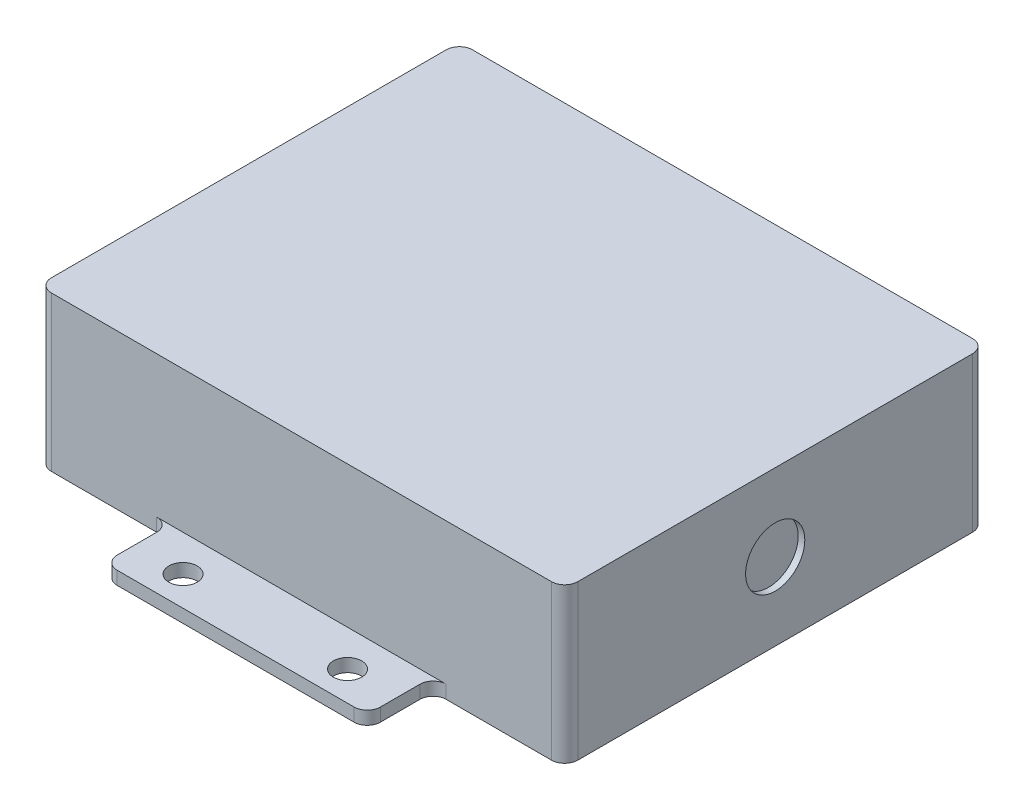
ISO-10303-21;
HEADER;
FILE_DESCRIPTION(('STEP AP214'),'2;1');
FILE_NAME('part.step','',(''),(''),'','','');
FILE_SCHEMA(('AUTOMOTIVE_DESIGN { 1 0 10303 214 1 1 1 1 }'));
ENDSEC;
DATA;
#1=APPLICATION_CONTEXT('core data for automotive mechanical design processes');
#2=APPLICATION_PROTOCOL_DEFINITION('international standard','automotive_design',2000,#1);
#3=PRODUCT_CONTEXT('',#1,'mechanical');
#4=PRODUCT('Part','Part','',(#3));
#5=PRODUCT_RELATED_PRODUCT_CATEGORY('part','',(#4));
#6=PRODUCT_DEFINITION_FORMATION('','',#4);
#7=PRODUCT_DEFINITION_CONTEXT('part definition',#1,'design');
#8=PRODUCT_DEFINITION('design','',#6,#7);
#9=PRODUCT_DEFINITION_SHAPE('','',#8);
#10=(LENGTH_UNIT() NAMED_UNIT(*) SI_UNIT(.MILLI.,.METRE.));
#11=(NAMED_UNIT(*) PLANE_ANGLE_UNIT() SI_UNIT($,.RADIAN.));
#12=(NAMED_UNIT(*) SI_UNIT($,.STERADIAN.) SOLID_ANGLE_UNIT());
#13=UNCERTAINTY_MEASURE_WITH_UNIT(LENGTH_MEASURE(1.E-05),#10,'distance_accuracy_value','');
#14=(GEOMETRIC_REPRESENTATION_CONTEXT(3) GLOBAL_UNCERTAINTY_ASSIGNED_CONTEXT((#13)) GLOBAL_UNIT_ASSIGNED_CONTEXT((#10,
#11,#12)) REPRESENTATION_CONTEXT('',''));
#15=CARTESIAN_POINT('',(0.,0.,0.));
#16=DIRECTION('',(0.,0.,1.));
#17=DIRECTION('',(1.,0.,0.));
#18=AXIS2_PLACEMENT_3D('',#15,#16,#17);
#19=CARTESIAN_POINT('',(0.,23.5,0.));
#20=DIRECTION('',(0.,-1.,0.));
#21=DIRECTION('',(0.,0.,-1.));
#22=AXIS2_PLACEMENT_3D('',#19,#20,#21);
#23=PLANE('',#22);
#24=DIRECTION('',(1.,0.,0.));
#25=VECTOR('',#24,1.);
#26=CARTESIAN_POINT('',(-40.,23.5,-32.));
#27=LINE('',#26,#25);
#28=CARTESIAN_POINT('',(-38.,23.5,-32.));
#29=VERTEX_POINT('',#28);
#30=CARTESIAN_POINT('',(38.,23.5,-32.));
#31=VERTEX_POINT('',#30);
#32=EDGE_CURVE('E474',#29,#31,#27,.T.);
#33=ORIENTED_EDGE('',*,*,#32,.F.);
#34=CARTESIAN_POINT('',(-38.,23.5,-30.));
#35=DIRECTION('',(0.,-1.,0.));
#36=DIRECTION('',(0.,0.,-1.));
#37=AXIS2_PLACEMENT_3D('',#34,#35,#36);
#38=CIRCLE('',#37,2.);
#39=CARTESIAN_POINT('',(-40.,23.5,-30.));
#40=VERTEX_POINT('',#39);
#41=EDGE_CURVE('E367',#29,#40,#38,.F.);
#42=ORIENTED_EDGE('',*,*,#41,.T.);
#43=DIRECTION('',(0.,0.,1.));
#44=VECTOR('',#43,1.);
#45=CARTESIAN_POINT('',(-40.,23.5,42.));
#46=LINE('',#45,#44);
#47=CARTESIAN_POINT('',(-40.,23.5,30.));
#48=VERTEX_POINT('',#47);
#49=EDGE_CURVE('E293',#40,#48,#46,.T.);
#50=ORIENTED_EDGE('',*,*,#49,.T.);
#51=CARTESIAN_POINT('',(-38.,23.5,30.));
#52=DIRECTION('',(0.,-1.,0.));
#53=DIRECTION('',(0.,0.,-1.));
#54=AXIS2_PLACEMENT_3D('',#51,#52,#53);
#55=CIRCLE('',#54,2.);
#56=CARTESIAN_POINT('',(-38.,23.5,32.));
#57=VERTEX_POINT('',#56);
#58=EDGE_CURVE('E365',#48,#57,#55,.F.);
#59=ORIENTED_EDGE('',*,*,#58,.T.);
#60=DIRECTION('',(-1.,0.,0.));
#61=VECTOR('',#60,1.);
#62=CARTESIAN_POINT('',(40.,23.5,32.));
#63=LINE('',#62,#61);
#64=CARTESIAN_POINT('',(38.,23.5,32.));
#65=VERTEX_POINT('',#64);
#66=EDGE_CURVE('E478',#65,#57,#63,.T.);
#67=ORIENTED_EDGE('',*,*,#66,.F.);
#68=CARTESIAN_POINT('',(38.,23.5,30.));
#69=DIRECTION('',(0.,-1.,0.));
#70=DIRECTION('',(0.,0.,-1.));
#71=AXIS2_PLACEMENT_3D('',#68,#69,#70);
#72=CIRCLE('',#71,2.);
#73=CARTESIAN_POINT('',(40.,23.5,30.));
#74=VERTEX_POINT('',#73);
#75=EDGE_CURVE('E361',#65,#74,#72,.F.);
#76=ORIENTED_EDGE('',*,*,#75,.T.);
#77=DIRECTION('',(0.,0.,-1.));
#78=VECTOR('',#77,1.);
#79=CARTESIAN_POINT('',(40.,23.5,42.));
#80=LINE('',#79,#78);
#81=CARTESIAN_POINT('',(40.,23.5,-30.));
#82=VERTEX_POINT('',#81);
#83=EDGE_CURVE('E290',#74,#82,#80,.T.);
#84=ORIENTED_EDGE('',*,*,#83,.T.);
#85=CARTESIAN_POINT('',(38.,23.5,-30.));
#86=DIRECTION('',(0.,-1.,0.));
#87=DIRECTION('',(0.,0.,-1.));
#88=AXIS2_PLACEMENT_3D('',#85,#86,#87);
#89=CIRCLE('',#88,2.);
#90=EDGE_CURVE('E363',#82,#31,#89,.F.);
#91=ORIENTED_EDGE('',*,*,#90,.T.);
#92=EDGE_LOOP('',(#33,#42,#50,#59,#67,#76,#84,#91));
#93=FACE_BOUND('',#92,.T.);
#94=ADVANCED_FACE('F45',(#93),#23,.F.);
#95=CARTESIAN_POINT('',(40.,23.5,42.));
#96=DIRECTION('',(-1.,0.,0.));
#97=DIRECTION('',(0.,0.,1.));
#98=AXIS2_PLACEMENT_3D('',#95,#96,#97);
#99=PLANE('',#98);
#100=CARTESIAN_POINT('',(40.,11.75,0.));
#101=DIRECTION('',(1.,0.,0.));
#102=DIRECTION('',(0.,0.,-1.));
#103=AXIS2_PLACEMENT_3D('',#100,#101,#102);
#104=CIRCLE('',#103,4.5);
#105=CARTESIAN_POINT('',(40.,11.75,-4.5));
#106=VERTEX_POINT('',#105);
#107=EDGE_CURVE('E261',#106,#106,#104,.T.);
#108=ORIENTED_EDGE('',*,*,#107,.F.);
#109=EDGE_LOOP('',(#108));
#110=FACE_BOUND('',#109,.T.);
#111=DIRECTION('',(0.,0.,-1.));
#112=VECTOR('',#111,1.);
#113=CARTESIAN_POINT('',(40.,0.,42.));
#114=LINE('',#113,#112);
#115=CARTESIAN_POINT('',(40.,0.,30.));
#116=VERTEX_POINT('',#115);
#117=CARTESIAN_POINT('',(40.,0.,-30.));
#118=VERTEX_POINT('',#117);
#119=EDGE_CURVE('E289',#116,#118,#114,.T.);
#120=ORIENTED_EDGE('',*,*,#119,.T.);
#121=DIRECTION('',(0.,1.,0.));
#122=VECTOR('',#121,1.);
#123=CARTESIAN_POINT('',(40.,23.5,-30.));
#124=LINE('',#123,#122);
#125=EDGE_CURVE('E403',#118,#82,#124,.T.);
#126=ORIENTED_EDGE('',*,*,#125,.T.);
#127=ORIENTED_EDGE('',*,*,#83,.F.);
#128=DIRECTION('',(0.,1.,0.));
#129=VECTOR('',#128,1.);
#130=CARTESIAN_POINT('',(40.,23.5,30.));
#131=LINE('',#130,#129);
#132=EDGE_CURVE('E401',#74,#116,#131,.F.);
#133=ORIENTED_EDGE('',*,*,#132,.T.);
#134=EDGE_LOOP('',(#120,#126,#127,#133));
#135=FACE_BOUND('',#134,.T.);
#136=ADVANCED_FACE('F496',(#110,#135),#99,.F.);
#137=CARTESIAN_POINT('',(-40.,23.5,-42.));
#138=DIRECTION('',(0.,0.,1.));
#139=DIRECTION('',(1.,0.,0.));
#140=AXIS2_PLACEMENT_3D('',#137,#138,#139);
#141=PLANE('',#140);
#142=DIRECTION('',(-1.,0.,0.));
#143=VECTOR('',#142,1.);
#144=CARTESIAN_POINT('',(-40.,2.,-42.));
#145=LINE('',#144,#143);
#146=CARTESIAN_POINT('',(18.,2.,-42.));
#147=VERTEX_POINT('',#146);
#148=CARTESIAN_POINT('',(-18.,2.,-42.));
#149=VERTEX_POINT('',#148);
#150=EDGE_CURVE('E312',#147,#149,#145,.T.);
#151=ORIENTED_EDGE('',*,*,#150,.F.);
#152=DIRECTION('',(0.,1.,0.));
#153=VECTOR('',#152,1.);
#154=CARTESIAN_POINT('',(18.,23.5,-42.));
#155=LINE('',#154,#153);
#156=CARTESIAN_POINT('',(18.,0.,-42.));
#157=VERTEX_POINT('',#156);
#158=EDGE_CURVE('E338',#147,#157,#155,.F.);
#159=ORIENTED_EDGE('',*,*,#158,.T.);
#160=DIRECTION('',(-1.,0.,0.));
#161=VECTOR('',#160,1.);
#162=CARTESIAN_POINT('',(-40.,0.,-42.));
#163=LINE('',#162,#161);
#164=CARTESIAN_POINT('',(-18.,0.,-42.));
#165=VERTEX_POINT('',#164);
#166=EDGE_CURVE('E300',#157,#165,#163,.T.);
#167=ORIENTED_EDGE('',*,*,#166,.T.);
#168=DIRECTION('',(0.,1.,0.));
#169=VECTOR('',#168,1.);
#170=CARTESIAN_POINT('',(-18.,23.5,-42.));
#171=LINE('',#170,#169);
#172=EDGE_CURVE('E335',#165,#149,#171,.T.);
#173=ORIENTED_EDGE('',*,*,#172,.T.);
#174=EDGE_LOOP('',(#151,#159,#167,#173));
#175=FACE_BOUND('',#174,.T.);
#176=ADVANCED_FACE('F499',(#175),#141,.F.);
#177=CARTESIAN_POINT('',(-40.,23.5,42.));
#178=DIRECTION('',(1.,0.,0.));
#179=DIRECTION('',(0.,0.,-1.));
#180=AXIS2_PLACEMENT_3D('',#177,#178,#179);
#181=PLANE('',#180);
#182=DIRECTION('',(0.,0.,-1.));
#183=VECTOR('',#182,1.);
#184=CARTESIAN_POINT('',(-40.,20.,-16.));
#185=LINE('',#184,#183);
#186=CARTESIAN_POINT('',(-40.,20.,16.));
#187=VERTEX_POINT('',#186);
#188=CARTESIAN_POINT('',(-40.,20.,-16.));
#189=VERTEX_POINT('',#188);
#190=EDGE_CURVE('E267',#187,#189,#185,.T.);
#191=ORIENTED_EDGE('',*,*,#190,.F.);
#192=DIRECTION('',(0.,1.,0.));
#193=VECTOR('',#192,1.);
#194=CARTESIAN_POINT('',(-40.,7.,16.));
#195=LINE('',#194,#193);
#196=CARTESIAN_POINT('',(-40.,7.,16.));
#197=VERTEX_POINT('',#196);
#198=EDGE_CURVE('E238',#197,#187,#195,.T.);
#199=ORIENTED_EDGE('',*,*,#198,.F.);
#200=DIRECTION('',(0.,0.,1.));
#201=VECTOR('',#200,1.);
#202=CARTESIAN_POINT('',(-40.,7.,-16.));
#203=LINE('',#202,#201);
#204=CARTESIAN_POINT('',(-40.,7.,-16.));
#205=VERTEX_POINT('',#204);
#206=EDGE_CURVE('E255',#205,#197,#203,.T.);
#207=ORIENTED_EDGE('',*,*,#206,.F.);
#208=DIRECTION('',(0.,-1.,0.));
#209=VECTOR('',#208,1.);
#210=CARTESIAN_POINT('',(-40.,7.,-16.));
#211=LINE('',#210,#209);
#212=EDGE_CURVE('E258',#189,#205,#211,.T.);
#213=ORIENTED_EDGE('',*,*,#212,.F.);
#214=EDGE_LOOP('',(#191,#199,#207,#213));
#215=FACE_BOUND('',#214,.T.);
#216=ORIENTED_EDGE('',*,*,#49,.F.);
#217=DIRECTION('',(0.,1.,0.));
#218=VECTOR('',#217,1.);
#219=CARTESIAN_POINT('',(-40.,23.5,-30.));
#220=LINE('',#219,#218);
#221=CARTESIAN_POINT('',(-40.,0.,-30.));
#222=VERTEX_POINT('',#221);
#223=EDGE_CURVE('E372',#40,#222,#220,.F.);
#224=ORIENTED_EDGE('',*,*,#223,.T.);
#225=DIRECTION('',(0.,0.,1.));
#226=VECTOR('',#225,1.);
#227=CARTESIAN_POINT('',(-40.,0.,42.));
#228=LINE('',#227,#226);
#229=CARTESIAN_POINT('',(-40.,0.,30.));
#230=VERTEX_POINT('',#229);
#231=EDGE_CURVE('E303',#222,#230,#228,.T.);
#232=ORIENTED_EDGE('',*,*,#231,.T.);
#233=DIRECTION('',(0.,1.,0.));
#234=VECTOR('',#233,1.);
#235=CARTESIAN_POINT('',(-40.,23.5,30.));
#236=LINE('',#235,#234);
#237=EDGE_CURVE('E369',#230,#48,#236,.T.);
#238=ORIENTED_EDGE('',*,*,#237,.T.);
#239=EDGE_LOOP('',(#216,#224,#232,#238));
#240=FACE_BOUND('',#239,.T.);
#241=ADVANCED_FACE('F521',(#215,#240),#181,.F.);
#242=CARTESIAN_POINT('',(-40.,23.5,42.));
#243=DIRECTION('',(0.,0.,-1.));
#244=DIRECTION('',(-1.,0.,0.));
#245=AXIS2_PLACEMENT_3D('',#242,#243,#244);
#246=PLANE('',#245);
#247=DIRECTION('',(1.,0.,0.));
#248=VECTOR('',#247,1.);
#249=CARTESIAN_POINT('',(40.,2.,42.));
#250=LINE('',#249,#248);
#251=CARTESIAN_POINT('',(-18.,2.,42.));
#252=VERTEX_POINT('',#251);
#253=CARTESIAN_POINT('',(18.,2.,42.));
#254=VERTEX_POINT('',#253);
#255=EDGE_CURVE('E471',#252,#254,#250,.T.);
#256=ORIENTED_EDGE('',*,*,#255,.F.);
#257=DIRECTION('',(0.,1.,0.));
#258=VECTOR('',#257,1.);
#259=CARTESIAN_POINT('',(-18.,23.5,42.));
#260=LINE('',#259,#258);
#261=CARTESIAN_POINT('',(-18.,0.,42.));
#262=VERTEX_POINT('',#261);
#263=EDGE_CURVE('E395',#252,#262,#260,.F.);
#264=ORIENTED_EDGE('',*,*,#263,.T.);
#265=DIRECTION('',(1.,0.,0.));
#266=VECTOR('',#265,1.);
#267=CARTESIAN_POINT('',(-40.,0.,42.));
#268=LINE('',#267,#266);
#269=CARTESIAN_POINT('',(18.,0.,42.));
#270=VERTEX_POINT('',#269);
#271=EDGE_CURVE('E294',#262,#270,#268,.T.);
#272=ORIENTED_EDGE('',*,*,#271,.T.);
#273=DIRECTION('',(0.,1.,0.));
#274=VECTOR('',#273,1.);
#275=CARTESIAN_POINT('',(18.,23.5,42.));
#276=LINE('',#275,#274);
#277=EDGE_CURVE('E392',#270,#254,#276,.T.);
#278=ORIENTED_EDGE('',*,*,#277,.T.);
#279=EDGE_LOOP('',(#256,#264,#272,#278));
#280=FACE_BOUND('',#279,.T.);
#281=ADVANCED_FACE('F546',(#280),#246,.F.);
#282=CARTESIAN_POINT('',(0.,0.,0.));
#283=DIRECTION('',(0.,-1.,0.));
#284=DIRECTION('',(0.,0.,-1.));
#285=AXIS2_PLACEMENT_3D('',#282,#283,#284);
#286=PLANE('',#285);
#287=ORIENTED_EDGE('',*,*,#166,.F.);
#288=CARTESIAN_POINT('',(18.,0.,-40.));
#289=DIRECTION('',(0.,-1.,0.));
#290=DIRECTION('',(0.,0.,-1.));
#291=AXIS2_PLACEMENT_3D('',#288,#289,#290);
#292=CIRCLE('',#291,2.);
#293=CARTESIAN_POINT('',(20.,0.,-40.));
#294=VERTEX_POINT('',#293);
#295=EDGE_CURVE('E354',#157,#294,#292,.T.);
#296=ORIENTED_EDGE('',*,*,#295,.T.);
#297=DIRECTION('',(0.,0.,1.));
#298=VECTOR('',#297,1.);
#299=CARTESIAN_POINT('',(20.,0.,-42.));
#300=LINE('',#299,#298);
#301=CARTESIAN_POINT('',(20.,0.,-34.));
#302=VERTEX_POINT('',#301);
#303=EDGE_CURVE('E451',#294,#302,#300,.T.);
#304=ORIENTED_EDGE('',*,*,#303,.T.);
#305=CARTESIAN_POINT('',(22.,0.,-34.));
#306=DIRECTION('',(0.,-1.,0.));
#307=DIRECTION('',(0.,0.,-1.));
#308=AXIS2_PLACEMENT_3D('',#305,#306,#307);
#309=CIRCLE('',#308,2.);
#310=CARTESIAN_POINT('',(22.,0.,-32.));
#311=VERTEX_POINT('',#310);
#312=EDGE_CURVE('E408',#302,#311,#309,.F.);
#313=ORIENTED_EDGE('',*,*,#312,.T.);
#314=DIRECTION('',(1.,0.,0.));
#315=VECTOR('',#314,1.);
#316=CARTESIAN_POINT('',(40.,0.,-32.));
#317=LINE('',#316,#315);
#318=CARTESIAN_POINT('',(38.,0.,-32.));
#319=VERTEX_POINT('',#318);
#320=EDGE_CURVE('E452',#311,#319,#317,.T.);
#321=ORIENTED_EDGE('',*,*,#320,.T.);
#322=CARTESIAN_POINT('',(38.,0.,-30.));
#323=DIRECTION('',(0.,-1.,0.));
#324=DIRECTION('',(0.,0.,-1.));
#325=AXIS2_PLACEMENT_3D('',#322,#323,#324);
#326=CIRCLE('',#325,2.);
#327=EDGE_CURVE('E342',#319,#118,#326,.T.);
#328=ORIENTED_EDGE('',*,*,#327,.T.);
#329=ORIENTED_EDGE('',*,*,#119,.F.);
#330=CARTESIAN_POINT('',(38.,0.,30.));
#331=DIRECTION('',(0.,-1.,0.));
#332=DIRECTION('',(0.,0.,-1.));
#333=AXIS2_PLACEMENT_3D('',#330,#331,#332);
#334=CIRCLE('',#333,2.);
#335=CARTESIAN_POINT('',(38.,0.,32.));
#336=VERTEX_POINT('',#335);
#337=EDGE_CURVE('E340',#116,#336,#334,.T.);
#338=ORIENTED_EDGE('',*,*,#337,.T.);
#339=DIRECTION('',(-1.,0.,0.));
#340=VECTOR('',#339,1.);
#341=CARTESIAN_POINT('',(40.,0.,32.));
#342=LINE('',#341,#340);
#343=CARTESIAN_POINT('',(22.,0.,32.));
#344=VERTEX_POINT('',#343);
#345=EDGE_CURVE('E431',#336,#344,#342,.T.);
#346=ORIENTED_EDGE('',*,*,#345,.T.);
#347=CARTESIAN_POINT('',(22.,0.,34.));
#348=DIRECTION('',(0.,-1.,0.));
#349=DIRECTION('',(0.,0.,-1.));
#350=AXIS2_PLACEMENT_3D('',#347,#348,#349);
#351=CIRCLE('',#350,2.);
#352=CARTESIAN_POINT('',(20.,0.,34.));
#353=VERTEX_POINT('',#352);
#354=EDGE_CURVE('E12',#344,#353,#351,.F.);
#355=ORIENTED_EDGE('',*,*,#354,.T.);
#356=DIRECTION('',(0.,0.,1.));
#357=VECTOR('',#356,1.);
#358=CARTESIAN_POINT('',(20.,0.,42.));
#359=LINE('',#358,#357);
#360=CARTESIAN_POINT('',(20.,0.,40.));
#361=VERTEX_POINT('',#360);
#362=EDGE_CURVE('E441',#353,#361,#359,.T.);
#363=ORIENTED_EDGE('',*,*,#362,.T.);
#364=CARTESIAN_POINT('',(18.,0.,40.));
#365=DIRECTION('',(0.,-1.,0.));
#366=DIRECTION('',(0.,0.,-1.));
#367=AXIS2_PLACEMENT_3D('',#364,#365,#366);
#368=CIRCLE('',#367,2.);
#369=EDGE_CURVE('E344',#361,#270,#368,.T.);
#370=ORIENTED_EDGE('',*,*,#369,.T.);
#371=ORIENTED_EDGE('',*,*,#271,.F.);
#372=CARTESIAN_POINT('',(-18.,0.,40.));
#373=DIRECTION('',(0.,-1.,0.));
#374=DIRECTION('',(0.,0.,-1.));
#375=AXIS2_PLACEMENT_3D('',#372,#373,#374);
#376=CIRCLE('',#375,2.);
#377=CARTESIAN_POINT('',(-20.,0.,40.));
#378=VERTEX_POINT('',#377);
#379=EDGE_CURVE('E346',#262,#378,#376,.T.);
#380=ORIENTED_EDGE('',*,*,#379,.T.);
#381=DIRECTION('',(0.,0.,-1.));
#382=VECTOR('',#381,1.);
#383=CARTESIAN_POINT('',(-20.,0.,42.));
#384=LINE('',#383,#382);
#385=CARTESIAN_POINT('',(-20.,0.,34.));
#386=VERTEX_POINT('',#385);
#387=EDGE_CURVE('E460',#378,#386,#384,.T.);
#388=ORIENTED_EDGE('',*,*,#387,.T.);
#389=CARTESIAN_POINT('',(-22.,0.,34.));
#390=DIRECTION('',(0.,-1.,0.));
#391=DIRECTION('',(0.,0.,-1.));
#392=AXIS2_PLACEMENT_3D('',#389,#390,#391);
#393=CIRCLE('',#392,2.);
#394=CARTESIAN_POINT('',(-22.,0.,32.));
#395=VERTEX_POINT('',#394);
#396=EDGE_CURVE('E417',#386,#395,#393,.F.);
#397=ORIENTED_EDGE('',*,*,#396,.T.);
#398=DIRECTION('',(-1.,0.,0.));
#399=VECTOR('',#398,1.);
#400=CARTESIAN_POINT('',(-40.,0.,32.));
#401=LINE('',#400,#399);
#402=CARTESIAN_POINT('',(-38.,0.,32.));
#403=VERTEX_POINT('',#402);
#404=EDGE_CURVE('E443',#395,#403,#401,.T.);
#405=ORIENTED_EDGE('',*,*,#404,.T.);
#406=CARTESIAN_POINT('',(-38.,0.,30.));
#407=DIRECTION('',(0.,-1.,0.));
#408=DIRECTION('',(0.,0.,-1.));
#409=AXIS2_PLACEMENT_3D('',#406,#407,#408);
#410=CIRCLE('',#409,2.);
#411=EDGE_CURVE('E348',#403,#230,#410,.T.);
#412=ORIENTED_EDGE('',*,*,#411,.T.);
#413=ORIENTED_EDGE('',*,*,#231,.F.);
#414=CARTESIAN_POINT('',(-38.,0.,-30.));
#415=DIRECTION('',(0.,-1.,0.));
#416=DIRECTION('',(0.,0.,-1.));
#417=AXIS2_PLACEMENT_3D('',#414,#415,#416);
#418=CIRCLE('',#417,2.);
#419=CARTESIAN_POINT('',(-38.,0.,-32.));
#420=VERTEX_POINT('',#419);
#421=EDGE_CURVE('E350',#222,#420,#418,.T.);
#422=ORIENTED_EDGE('',*,*,#421,.T.);
#423=DIRECTION('',(1.,0.,0.));
#424=VECTOR('',#423,1.);
#425=CARTESIAN_POINT('',(-40.,0.,-32.));
#426=LINE('',#425,#424);
#427=CARTESIAN_POINT('',(-22.,0.,-32.));
#428=VERTEX_POINT('',#427);
#429=EDGE_CURVE('E465',#420,#428,#426,.T.);
#430=ORIENTED_EDGE('',*,*,#429,.T.);
#431=CARTESIAN_POINT('',(-22.,0.,-34.));
#432=DIRECTION('',(0.,-1.,0.));
#433=DIRECTION('',(0.,0.,-1.));
#434=AXIS2_PLACEMENT_3D('',#431,#432,#433);
#435=CIRCLE('',#434,2.);
#436=CARTESIAN_POINT('',(-20.,0.,-34.));
#437=VERTEX_POINT('',#436);
#438=EDGE_CURVE('E413',#428,#437,#435,.F.);
#439=ORIENTED_EDGE('',*,*,#438,.T.);
#440=DIRECTION('',(0.,0.,-1.));
#441=VECTOR('',#440,1.);
#442=CARTESIAN_POINT('',(-20.,0.,-42.));
#443=LINE('',#442,#441);
#444=CARTESIAN_POINT('',(-20.,0.,-40.));
#445=VERTEX_POINT('',#444);
#446=EDGE_CURVE('E468',#437,#445,#443,.T.);
#447=ORIENTED_EDGE('',*,*,#446,.T.);
#448=CARTESIAN_POINT('',(-18.,0.,-40.));
#449=DIRECTION('',(0.,-1.,0.));
#450=DIRECTION('',(0.,0.,-1.));
#451=AXIS2_PLACEMENT_3D('',#448,#449,#450);
#452=CIRCLE('',#451,2.);
#453=EDGE_CURVE('E352',#445,#165,#452,.T.);
#454=ORIENTED_EDGE('',*,*,#453,.T.);
#455=EDGE_LOOP('',(#287,#296,#304,#313,#321,#328,#329,#338,#346,#355,#363,#370,#371,#380,#388,
#397,#405,#412,#413,#422,#430,#439,#447,#454));
#456=FACE_BOUND('',#455,.T.);
#457=CARTESIAN_POINT('',(-12.5,0.,-37.5));
#458=DIRECTION('',(0.,1.,0.));
#459=DIRECTION('',(0.,0.,1.));
#460=AXIS2_PLACEMENT_3D('',#457,#458,#459);
#461=CIRCLE('',#460,2.15);
#462=CARTESIAN_POINT('',(-12.5,0.,-35.35));
#463=VERTEX_POINT('',#462);
#464=EDGE_CURVE('E274',#463,#463,#461,.T.);
#465=ORIENTED_EDGE('',*,*,#464,.T.);
#466=EDGE_LOOP('',(#465));
#467=FACE_BOUND('',#466,.T.);
#468=CARTESIAN_POINT('',(12.5,0.,-37.5));
#469=DIRECTION('',(0.,1.,0.));
#470=DIRECTION('',(0.,0.,1.));
#471=AXIS2_PLACEMENT_3D('',#468,#469,#470);
#472=CIRCLE('',#471,2.15);
#473=CARTESIAN_POINT('',(12.5,0.,-35.35));
#474=VERTEX_POINT('',#473);
#475=EDGE_CURVE('E280',#474,#474,#472,.T.);
#476=ORIENTED_EDGE('',*,*,#475,.T.);
#477=EDGE_LOOP('',(#476));
#478=FACE_BOUND('',#477,.T.);
#479=CARTESIAN_POINT('',(-12.5,0.,37.5));
#480=DIRECTION('',(0.,1.,0.));
#481=DIRECTION('',(0.,0.,1.));
#482=AXIS2_PLACEMENT_3D('',#479,#480,#481);
#483=CIRCLE('',#482,2.15);
#484=CARTESIAN_POINT('',(-12.5,0.,39.65));
#485=VERTEX_POINT('',#484);
#486=EDGE_CURVE('E283',#485,#485,#483,.T.);
#487=ORIENTED_EDGE('',*,*,#486,.T.);
#488=EDGE_LOOP('',(#487));
#489=FACE_BOUND('',#488,.T.);
#490=CARTESIAN_POINT('',(12.5,0.,37.5));
#491=DIRECTION('',(0.,1.,0.));
#492=DIRECTION('',(0.,0.,1.));
#493=AXIS2_PLACEMENT_3D('',#490,#491,#492);
#494=CIRCLE('',#493,2.15);
#495=CARTESIAN_POINT('',(12.5,0.,39.65));
#496=VERTEX_POINT('',#495);
#497=EDGE_CURVE('E286',#496,#496,#494,.T.);
#498=ORIENTED_EDGE('',*,*,#497,.T.);
#499=EDGE_LOOP('',(#498));
#500=FACE_BOUND('',#499,.T.);
#501=ADVANCED_FACE('F435',(#456,#467,#478,#489,#500),#286,.T.);
#502=CARTESIAN_POINT('',(12.5,23.5,37.5));
#503=DIRECTION('',(0.,1.,0.));
#504=DIRECTION('',(0.,0.,1.));
#505=AXIS2_PLACEMENT_3D('',#502,#503,#504);
#506=CYLINDRICAL_SURFACE('',#505,2.15);
#507=CARTESIAN_POINT('',(12.5,2.,37.5));
#508=DIRECTION('',(0.,-1.,0.));
#509=DIRECTION('',(0.,0.,-1.));
#510=AXIS2_PLACEMENT_3D('',#507,#508,#509);
#511=CIRCLE('',#510,2.15);
#512=CARTESIAN_POINT('',(12.5,2.,35.35));
#513=VERTEX_POINT('',#512);
#514=EDGE_CURVE('E316',#513,#513,#511,.F.);
#515=ORIENTED_EDGE('',*,*,#514,.T.);
#516=EDGE_LOOP('',(#515));
#517=FACE_BOUND('',#516,.T.);
#518=ORIENTED_EDGE('',*,*,#497,.F.);
#519=EDGE_LOOP('',(#518));
#520=FACE_BOUND('',#519,.T.);
#521=ADVANCED_FACE('F542',(#517,#520),#506,.F.);
#522=CARTESIAN_POINT('',(-12.5,23.5,37.5));
#523=DIRECTION('',(0.,1.,0.));
#524=DIRECTION('',(0.,0.,1.));
#525=AXIS2_PLACEMENT_3D('',#522,#523,#524);
#526=CYLINDRICAL_SURFACE('',#525,2.15);
#527=CARTESIAN_POINT('',(-12.5,2.,37.5));
#528=DIRECTION('',(0.,-1.,0.));
#529=DIRECTION('',(0.,0.,-1.));
#530=AXIS2_PLACEMENT_3D('',#527,#528,#529);
#531=CIRCLE('',#530,2.15);
#532=CARTESIAN_POINT('',(-12.5,2.,35.35));
#533=VERTEX_POINT('',#532);
#534=EDGE_CURVE('E313',#533,#533,#531,.F.);
#535=ORIENTED_EDGE('',*,*,#534,.T.);
#536=EDGE_LOOP('',(#535));
#537=FACE_BOUND('',#536,.T.);
#538=ORIENTED_EDGE('',*,*,#486,.F.);
#539=EDGE_LOOP('',(#538));
#540=FACE_BOUND('',#539,.T.);
#541=ADVANCED_FACE('F790',(#537,#540),#526,.F.);
#542=CARTESIAN_POINT('',(12.5,23.5,-37.5));
#543=DIRECTION('',(0.,1.,0.));
#544=DIRECTION('',(0.,0.,1.));
#545=AXIS2_PLACEMENT_3D('',#542,#543,#544);
#546=CYLINDRICAL_SURFACE('',#545,2.15);
#547=CARTESIAN_POINT('',(12.5,2.,-37.5));
#548=DIRECTION('',(0.,-1.,0.));
#549=DIRECTION('',(0.,0.,-1.));
#550=AXIS2_PLACEMENT_3D('',#547,#548,#549);
#551=CIRCLE('',#550,2.15);
#552=CARTESIAN_POINT('',(12.5,2.,-39.65));
#553=VERTEX_POINT('',#552);
#554=EDGE_CURVE('E311',#553,#553,#551,.F.);
#555=ORIENTED_EDGE('',*,*,#554,.T.);
#556=EDGE_LOOP('',(#555));
#557=FACE_BOUND('',#556,.T.);
#558=ORIENTED_EDGE('',*,*,#475,.F.);
#559=EDGE_LOOP('',(#558));
#560=FACE_BOUND('',#559,.T.);
#561=ADVANCED_FACE('F781',(#557,#560),#546,.F.);
#562=CARTESIAN_POINT('',(-12.5,23.5,-37.5));
#563=DIRECTION('',(0.,1.,0.));
#564=DIRECTION('',(0.,0.,1.));
#565=AXIS2_PLACEMENT_3D('',#562,#563,#564);
#566=CYLINDRICAL_SURFACE('',#565,2.15);
#567=CARTESIAN_POINT('',(-12.5,2.,-37.5));
#568=DIRECTION('',(0.,-1.,0.));
#569=DIRECTION('',(0.,0.,-1.));
#570=AXIS2_PLACEMENT_3D('',#567,#568,#569);
#571=CIRCLE('',#570,2.15);
#572=CARTESIAN_POINT('',(-12.5,2.,-39.65));
#573=VERTEX_POINT('',#572);
#574=EDGE_CURVE('E308',#573,#573,#571,.F.);
#575=ORIENTED_EDGE('',*,*,#574,.T.);
#576=EDGE_LOOP('',(#575));
#577=FACE_BOUND('',#576,.T.);
#578=ORIENTED_EDGE('',*,*,#464,.F.);
#579=EDGE_LOOP('',(#578));
#580=FACE_BOUND('',#579,.T.);
#581=ADVANCED_FACE('F774',(#577,#580),#566,.F.);
#582=CARTESIAN_POINT('',(-39.,7.,16.));
#583=DIRECTION('',(0.,0.,1.));
#584=DIRECTION('',(1.,0.,0.));
#585=AXIS2_PLACEMENT_3D('',#582,#583,#584);
#586=PLANE('',#585);
#587=ORIENTED_EDGE('',*,*,#198,.T.);
#588=DIRECTION('',(-1.,0.,0.));
#589=VECTOR('',#588,1.);
#590=CARTESIAN_POINT('',(-39.,20.,16.));
#591=LINE('',#590,#589);
#592=CARTESIAN_POINT('',(-39.,20.,16.));
#593=VERTEX_POINT('',#592);
#594=EDGE_CURVE('E231',#593,#187,#591,.T.);
#595=ORIENTED_EDGE('',*,*,#594,.F.);
#596=DIRECTION('',(0.,1.,0.));
#597=VECTOR('',#596,1.);
#598=CARTESIAN_POINT('',(-39.,7.,16.));
#599=LINE('',#598,#597);
#600=CARTESIAN_POINT('',(-39.,7.,16.));
#601=VERTEX_POINT('',#600);
#602=EDGE_CURVE('E235',#601,#593,#599,.T.);
#603=ORIENTED_EDGE('',*,*,#602,.F.);
#604=DIRECTION('',(-1.,0.,0.));
#605=VECTOR('',#604,1.);
#606=CARTESIAN_POINT('',(-39.,7.,16.));
#607=LINE('',#606,#605);
#608=EDGE_CURVE('E272',#601,#197,#607,.T.);
#609=ORIENTED_EDGE('',*,*,#608,.T.);
#610=EDGE_LOOP('',(#587,#595,#603,#609));
#611=FACE_BOUND('',#610,.T.);
#612=ADVANCED_FACE('F233',(#611),#586,.F.);
#613=CARTESIAN_POINT('',(-39.,7.,-16.));
#614=DIRECTION('',(0.,-1.,0.));
#615=DIRECTION('',(0.,0.,-1.));
#616=AXIS2_PLACEMENT_3D('',#613,#614,#615);
#617=PLANE('',#616);
#618=ORIENTED_EDGE('',*,*,#206,.T.);
#619=ORIENTED_EDGE('',*,*,#608,.F.);
#620=DIRECTION('',(0.,0.,1.));
#621=VECTOR('',#620,1.);
#622=CARTESIAN_POINT('',(-39.,7.,-16.));
#623=LINE('',#622,#621);
#624=CARTESIAN_POINT('',(-39.,7.,-16.));
#625=VERTEX_POINT('',#624);
#626=EDGE_CURVE('E243',#625,#601,#623,.T.);
#627=ORIENTED_EDGE('',*,*,#626,.F.);
#628=DIRECTION('',(-1.,0.,0.));
#629=VECTOR('',#628,1.);
#630=CARTESIAN_POINT('',(-39.,7.,-16.));
#631=LINE('',#630,#629);
#632=EDGE_CURVE('E275',#625,#205,#631,.T.);
#633=ORIENTED_EDGE('',*,*,#632,.T.);
#634=EDGE_LOOP('',(#618,#619,#627,#633));
#635=FACE_BOUND('',#634,.T.);
#636=ADVANCED_FACE('F757',(#635),#617,.F.);
#637=CARTESIAN_POINT('',(-39.,7.,-16.));
#638=DIRECTION('',(0.,0.,-1.));
#639=DIRECTION('',(-1.,0.,0.));
#640=AXIS2_PLACEMENT_3D('',#637,#638,#639);
#641=PLANE('',#640);
#642=ORIENTED_EDGE('',*,*,#212,.T.);
#643=ORIENTED_EDGE('',*,*,#632,.F.);
#644=DIRECTION('',(0.,-1.,0.));
#645=VECTOR('',#644,1.);
#646=CARTESIAN_POINT('',(-39.,7.,-16.));
#647=LINE('',#646,#645);
#648=CARTESIAN_POINT('',(-39.,20.,-16.));
#649=VERTEX_POINT('',#648);
#650=EDGE_CURVE('E251',#649,#625,#647,.T.);
#651=ORIENTED_EDGE('',*,*,#650,.F.);
#652=DIRECTION('',(-1.,0.,0.));
#653=VECTOR('',#652,1.);
#654=CARTESIAN_POINT('',(-39.,20.,-16.));
#655=LINE('',#654,#653);
#656=EDGE_CURVE('E242',#649,#189,#655,.T.);
#657=ORIENTED_EDGE('',*,*,#656,.T.);
#658=EDGE_LOOP('',(#642,#643,#651,#657));
#659=FACE_BOUND('',#658,.T.);
#660=ADVANCED_FACE('F749',(#659),#641,.F.);
#661=CARTESIAN_POINT('',(-39.,20.,-16.));
#662=DIRECTION('',(0.,1.,0.));
#663=DIRECTION('',(0.,0.,1.));
#664=AXIS2_PLACEMENT_3D('',#661,#662,#663);
#665=PLANE('',#664);
#666=ORIENTED_EDGE('',*,*,#190,.T.);
#667=ORIENTED_EDGE('',*,*,#656,.F.);
#668=DIRECTION('',(0.,0.,-1.));
#669=VECTOR('',#668,1.);
#670=CARTESIAN_POINT('',(-39.,20.,-16.));
#671=LINE('',#670,#669);
#672=EDGE_CURVE('E246',#593,#649,#671,.T.);
#673=ORIENTED_EDGE('',*,*,#672,.F.);
#674=ORIENTED_EDGE('',*,*,#594,.T.);
#675=EDGE_LOOP('',(#666,#667,#673,#674));
#676=FACE_BOUND('',#675,.T.);
#677=ADVANCED_FACE('F247',(#676),#665,.F.);
#678=CARTESIAN_POINT('',(-39.,0.,0.));
#679=DIRECTION('',(1.,0.,0.));
#680=DIRECTION('',(0.,0.,-1.));
#681=AXIS2_PLACEMENT_3D('',#678,#679,#680);
#682=PLANE('',#681);
#683=ORIENTED_EDGE('',*,*,#602,.T.);
#684=ORIENTED_EDGE('',*,*,#672,.T.);
#685=ORIENTED_EDGE('',*,*,#650,.T.);
#686=ORIENTED_EDGE('',*,*,#626,.T.);
#687=EDGE_LOOP('',(#683,#684,#685,#686));
#688=FACE_BOUND('',#687,.T.);
#689=ADVANCED_FACE('F253',(#688),#682,.F.);
#690=CARTESIAN_POINT('',(39.,11.75,0.));
#691=DIRECTION('',(1.,0.,0.));
#692=DIRECTION('',(0.,0.,-1.));
#693=AXIS2_PLACEMENT_3D('',#690,#691,#692);
#694=CYLINDRICAL_SURFACE('',#693,4.5);
#695=CARTESIAN_POINT('',(39.,11.75,0.));
#696=DIRECTION('',(1.,0.,0.));
#697=DIRECTION('',(0.,0.,-1.));
#698=AXIS2_PLACEMENT_3D('',#695,#696,#697);
#699=CIRCLE('',#698,4.5);
#700=CARTESIAN_POINT('',(39.,11.75,-4.5));
#701=VERTEX_POINT('',#700);
#702=EDGE_CURVE('E268',#701,#701,#699,.T.);
#703=ORIENTED_EDGE('',*,*,#702,.F.);
#704=EDGE_LOOP('',(#703));
#705=FACE_BOUND('',#704,.T.);
#706=ORIENTED_EDGE('',*,*,#107,.T.);
#707=EDGE_LOOP('',(#706));
#708=FACE_BOUND('',#707,.T.);
#709=ADVANCED_FACE('F494',(#705,#708),#694,.F.);
#710=CARTESIAN_POINT('',(39.,11.75,0.));
#711=DIRECTION('',(1.,0.,0.));
#712=DIRECTION('',(0.,0.,-1.));
#713=AXIS2_PLACEMENT_3D('',#710,#711,#712);
#714=PLANE('',#713);
#715=ORIENTED_EDGE('',*,*,#702,.T.);
#716=EDGE_LOOP('',(#715));
#717=FACE_BOUND('',#716,.T.);
#718=ADVANCED_FACE('F718',(#717),#714,.T.);
#719=CARTESIAN_POINT('',(0.,2.,0.));
#720=DIRECTION('',(0.,-1.,0.));
#721=DIRECTION('',(0.,0.,-1.));
#722=AXIS2_PLACEMENT_3D('',#719,#720,#721);
#723=PLANE('',#722);
#724=ORIENTED_EDGE('',*,*,#574,.F.);
#725=EDGE_LOOP('',(#724));
#726=FACE_BOUND('',#725,.T.);
#727=DIRECTION('',(0.,0.,1.));
#728=VECTOR('',#727,1.);
#729=CARTESIAN_POINT('',(20.,2.,-42.));
#730=LINE('',#729,#728);
#731=CARTESIAN_POINT('',(20.,2.,-40.));
#732=VERTEX_POINT('',#731);
#733=CARTESIAN_POINT('',(20.,2.,-34.));
#734=VERTEX_POINT('',#733);
#735=EDGE_CURVE('E447',#732,#734,#730,.T.);
#736=ORIENTED_EDGE('',*,*,#735,.F.);
#737=CARTESIAN_POINT('',(18.,2.,-40.));
#738=DIRECTION('',(0.,-1.,0.));
#739=DIRECTION('',(0.,0.,-1.));
#740=AXIS2_PLACEMENT_3D('',#737,#738,#739);
#741=CIRCLE('',#740,2.);
#742=EDGE_CURVE('E333',#732,#147,#741,.F.);
#743=ORIENTED_EDGE('',*,*,#742,.T.);
#744=ORIENTED_EDGE('',*,*,#150,.T.);
#745=CARTESIAN_POINT('',(-18.,2.,-40.));
#746=DIRECTION('',(0.,-1.,0.));
#747=DIRECTION('',(0.,0.,-1.));
#748=AXIS2_PLACEMENT_3D('',#745,#746,#747);
#749=CIRCLE('',#748,2.);
#750=CARTESIAN_POINT('',(-20.,2.,-40.));
#751=VERTEX_POINT('',#750);
#752=EDGE_CURVE('E331',#149,#751,#749,.F.);
#753=ORIENTED_EDGE('',*,*,#752,.T.);
#754=DIRECTION('',(0.,0.,-1.));
#755=VECTOR('',#754,1.);
#756=CARTESIAN_POINT('',(-20.,2.,-42.));
#757=LINE('',#756,#755);
#758=CARTESIAN_POINT('',(-20.,2.,-34.));
#759=VERTEX_POINT('',#758);
#760=EDGE_CURVE('E450',#759,#751,#757,.T.);
#761=ORIENTED_EDGE('',*,*,#760,.F.);
#762=CARTESIAN_POINT('',(-22.,2.,-34.));
#763=DIRECTION('',(0.,-1.,0.));
#764=DIRECTION('',(0.,0.,-1.));
#765=AXIS2_PLACEMENT_3D('',#762,#763,#764);
#766=CIRCLE('',#765,2.);
#767=CARTESIAN_POINT('',(-22.,2.,-32.));
#768=VERTEX_POINT('',#767);
#769=EDGE_CURVE('E410',#759,#768,#766,.T.);
#770=ORIENTED_EDGE('',*,*,#769,.T.);
#771=DIRECTION('',(1.,0.,0.));
#772=VECTOR('',#771,1.);
#773=CARTESIAN_POINT('',(-40.,2.,-32.));
#774=LINE('',#773,#772);
#775=CARTESIAN_POINT('',(22.,2.,-32.));
#776=VERTEX_POINT('',#775);
#777=EDGE_CURVE('E477',#768,#776,#774,.T.);
#778=ORIENTED_EDGE('',*,*,#777,.T.);
#779=CARTESIAN_POINT('',(22.,2.,-34.));
#780=DIRECTION('',(0.,-1.,0.));
#781=DIRECTION('',(0.,0.,-1.));
#782=AXIS2_PLACEMENT_3D('',#779,#780,#781);
#783=CIRCLE('',#782,2.);
#784=EDGE_CURVE('E406',#776,#734,#783,.T.);
#785=ORIENTED_EDGE('',*,*,#784,.T.);
#786=EDGE_LOOP('',(#736,#743,#744,#753,#761,#770,#778,#785));
#787=FACE_BOUND('',#786,.T.);
#788=ORIENTED_EDGE('',*,*,#554,.F.);
#789=EDGE_LOOP('',(#788));
#790=FACE_BOUND('',#789,.T.);
#791=ADVANCED_FACE('F710',(#726,#787,#790),#723,.F.);
#792=CARTESIAN_POINT('',(-40.,-80.6225774829855,-32.));
#793=DIRECTION('',(0.,0.,1.));
#794=DIRECTION('',(1.,0.,0.));
#795=AXIS2_PLACEMENT_3D('',#792,#793,#794);
#796=PLANE('',#795);
#797=ORIENTED_EDGE('',*,*,#320,.F.);
#798=DIRECTION('',(0.,1.,0.));
#799=VECTOR('',#798,1.);
#800=CARTESIAN_POINT('',(22.,2.,-32.));
#801=LINE('',#800,#799);
#802=EDGE_CURVE('E323',#311,#776,#801,.T.);
#803=ORIENTED_EDGE('',*,*,#802,.T.);
#804=ORIENTED_EDGE('',*,*,#777,.F.);
#805=DIRECTION('',(0.,1.,0.));
#806=VECTOR('',#805,1.);
#807=CARTESIAN_POINT('',(-22.,0.,-32.));
#808=LINE('',#807,#806);
#809=EDGE_CURVE('E321',#768,#428,#808,.F.);
#810=ORIENTED_EDGE('',*,*,#809,.T.);
#811=ORIENTED_EDGE('',*,*,#429,.F.);
#812=DIRECTION('',(0.,1.,0.));
#813=VECTOR('',#812,1.);
#814=CARTESIAN_POINT('',(-38.,-80.6225774829855,-32.));
#815=LINE('',#814,#813);
#816=EDGE_CURVE('E318',#420,#29,#815,.T.);
#817=ORIENTED_EDGE('',*,*,#816,.T.);
#818=ORIENTED_EDGE('',*,*,#32,.T.);
#819=DIRECTION('',(0.,1.,0.));
#820=VECTOR('',#819,1.);
#821=CARTESIAN_POINT('',(38.,-80.6225774829855,-32.));
#822=LINE('',#821,#820);
#823=EDGE_CURVE('E297',#31,#319,#822,.F.);
#824=ORIENTED_EDGE('',*,*,#823,.T.);
#825=EDGE_LOOP('',(#797,#803,#804,#810,#811,#817,#818,#824));
#826=FACE_BOUND('',#825,.T.);
#827=ADVANCED_FACE('F512',(#826),#796,.F.);
#828=CARTESIAN_POINT('',(0.,2.,0.));
#829=DIRECTION('',(0.,-1.,0.));
#830=DIRECTION('',(0.,0.,-1.));
#831=AXIS2_PLACEMENT_3D('',#828,#829,#830);
#832=PLANE('',#831);
#833=ORIENTED_EDGE('',*,*,#534,.F.);
#834=EDGE_LOOP('',(#833));
#835=FACE_BOUND('',#834,.T.);
#836=DIRECTION('',(0.,0.,-1.));
#837=VECTOR('',#836,1.);
#838=CARTESIAN_POINT('',(-20.,2.,42.));
#839=LINE('',#838,#837);
#840=CARTESIAN_POINT('',(-20.,2.,40.));
#841=VERTEX_POINT('',#840);
#842=CARTESIAN_POINT('',(-20.,2.,34.));
#843=VERTEX_POINT('',#842);
#844=EDGE_CURVE('E455',#841,#843,#839,.T.);
#845=ORIENTED_EDGE('',*,*,#844,.F.);
#846=CARTESIAN_POINT('',(-18.,2.,40.));
#847=DIRECTION('',(0.,-1.,0.));
#848=DIRECTION('',(0.,0.,-1.));
#849=AXIS2_PLACEMENT_3D('',#846,#847,#848);
#850=CIRCLE('',#849,2.);
#851=EDGE_CURVE('E390',#841,#252,#850,.F.);
#852=ORIENTED_EDGE('',*,*,#851,.T.);
#853=ORIENTED_EDGE('',*,*,#255,.T.);
#854=CARTESIAN_POINT('',(18.,2.,40.));
#855=DIRECTION('',(0.,-1.,0.));
#856=DIRECTION('',(0.,0.,-1.));
#857=AXIS2_PLACEMENT_3D('',#854,#855,#856);
#858=CIRCLE('',#857,2.);
#859=CARTESIAN_POINT('',(20.,2.,40.));
#860=VERTEX_POINT('',#859);
#861=EDGE_CURVE('E60',#254,#860,#858,.F.);
#862=ORIENTED_EDGE('',*,*,#861,.T.);
#863=DIRECTION('',(0.,0.,1.));
#864=VECTOR('',#863,1.);
#865=CARTESIAN_POINT('',(20.,2.,42.));
#866=LINE('',#865,#864);
#867=CARTESIAN_POINT('',(20.,2.,34.));
#868=VERTEX_POINT('',#867);
#869=EDGE_CURVE('E423',#868,#860,#866,.T.);
#870=ORIENTED_EDGE('',*,*,#869,.F.);
#871=CARTESIAN_POINT('',(22.,2.,34.));
#872=DIRECTION('',(0.,-1.,0.));
#873=DIRECTION('',(0.,0.,-1.));
#874=AXIS2_PLACEMENT_3D('',#871,#872,#873);
#875=CIRCLE('',#874,2.);
#876=CARTESIAN_POINT('',(22.,2.,32.));
#877=VERTEX_POINT('',#876);
#878=EDGE_CURVE('E53',#868,#877,#875,.T.);
#879=ORIENTED_EDGE('',*,*,#878,.T.);
#880=DIRECTION('',(-1.,0.,0.));
#881=VECTOR('',#880,1.);
#882=CARTESIAN_POINT('',(40.,2.,32.));
#883=LINE('',#882,#881);
#884=CARTESIAN_POINT('',(-22.,2.,32.));
#885=VERTEX_POINT('',#884);
#886=EDGE_CURVE('E421',#877,#885,#883,.T.);
#887=ORIENTED_EDGE('',*,*,#886,.T.);
#888=CARTESIAN_POINT('',(-22.,2.,34.));
#889=DIRECTION('',(0.,-1.,0.));
#890=DIRECTION('',(0.,0.,-1.));
#891=AXIS2_PLACEMENT_3D('',#888,#889,#890);
#892=CIRCLE('',#891,2.);
#893=EDGE_CURVE('E415',#885,#843,#892,.T.);
#894=ORIENTED_EDGE('',*,*,#893,.T.);
#895=EDGE_LOOP('',(#845,#852,#853,#862,#870,#879,#887,#894));
#896=FACE_BOUND('',#895,.T.);
#897=ORIENTED_EDGE('',*,*,#514,.F.);
#898=EDGE_LOOP('',(#897));
#899=FACE_BOUND('',#898,.T.);
#900=ADVANCED_FACE('F419',(#835,#896,#899),#832,.F.);
#901=CARTESIAN_POINT('',(40.,-80.6225774829855,32.));
#902=DIRECTION('',(0.,0.,-1.));
#903=DIRECTION('',(-1.,0.,0.));
#904=AXIS2_PLACEMENT_3D('',#901,#902,#903);
#905=PLANE('',#904);
#906=ORIENTED_EDGE('',*,*,#66,.T.);
#907=DIRECTION('',(0.,1.,0.));
#908=VECTOR('',#907,1.);
#909=CARTESIAN_POINT('',(-38.,-80.6225774829855,32.));
#910=LINE('',#909,#908);
#911=EDGE_CURVE('E382',#57,#403,#910,.F.);
#912=ORIENTED_EDGE('',*,*,#911,.T.);
#913=ORIENTED_EDGE('',*,*,#404,.F.);
#914=DIRECTION('',(0.,1.,0.));
#915=VECTOR('',#914,1.);
#916=CARTESIAN_POINT('',(-22.,2.,32.));
#917=LINE('',#916,#915);
#918=EDGE_CURVE('E379',#395,#885,#917,.T.);
#919=ORIENTED_EDGE('',*,*,#918,.T.);
#920=ORIENTED_EDGE('',*,*,#886,.F.);
#921=DIRECTION('',(0.,1.,0.));
#922=VECTOR('',#921,1.);
#923=CARTESIAN_POINT('',(22.,0.,32.));
#924=LINE('',#923,#922);
#925=EDGE_CURVE('E377',#877,#344,#924,.F.);
#926=ORIENTED_EDGE('',*,*,#925,.T.);
#927=ORIENTED_EDGE('',*,*,#345,.F.);
#928=DIRECTION('',(0.,1.,0.));
#929=VECTOR('',#928,1.);
#930=CARTESIAN_POINT('',(38.,-80.6225774829855,32.));
#931=LINE('',#930,#929);
#932=EDGE_CURVE('E374',#336,#65,#931,.T.);
#933=ORIENTED_EDGE('',*,*,#932,.T.);
#934=EDGE_LOOP('',(#906,#912,#913,#919,#920,#926,#927,#933));
#935=FACE_BOUND('',#934,.T.);
#936=ADVANCED_FACE('F430',(#935),#905,.F.);
#937=CARTESIAN_POINT('',(20.,0.,42.));
#938=DIRECTION('',(-1.,0.,0.));
#939=DIRECTION('',(0.,0.,1.));
#940=AXIS2_PLACEMENT_3D('',#937,#938,#939);
#941=PLANE('',#940);
#942=ORIENTED_EDGE('',*,*,#869,.T.);
#943=DIRECTION('',(0.,1.,0.));
#944=VECTOR('',#943,1.);
#945=CARTESIAN_POINT('',(20.,0.,40.));
#946=LINE('',#945,#944);
#947=EDGE_CURVE('E399',#860,#361,#946,.F.);
#948=ORIENTED_EDGE('',*,*,#947,.T.);
#949=ORIENTED_EDGE('',*,*,#362,.F.);
#950=DIRECTION('',(0.,1.,0.));
#951=VECTOR('',#950,1.);
#952=CARTESIAN_POINT('',(20.,2.,34.));
#953=LINE('',#952,#951);
#954=EDGE_CURVE('E397',#353,#868,#953,.T.);
#955=ORIENTED_EDGE('',*,*,#954,.T.);
#956=EDGE_LOOP('',(#942,#948,#949,#955));
#957=FACE_BOUND('',#956,.T.);
#958=ADVANCED_FACE('F675',(#957),#941,.F.);
#959=CARTESIAN_POINT('',(-20.,0.,42.));
#960=DIRECTION('',(1.,0.,0.));
#961=DIRECTION('',(0.,0.,-1.));
#962=AXIS2_PLACEMENT_3D('',#959,#960,#961);
#963=PLANE('',#962);
#964=ORIENTED_EDGE('',*,*,#844,.T.);
#965=DIRECTION('',(0.,1.,0.));
#966=VECTOR('',#965,1.);
#967=CARTESIAN_POINT('',(-20.,0.,34.));
#968=LINE('',#967,#966);
#969=EDGE_CURVE('E387',#843,#386,#968,.F.);
#970=ORIENTED_EDGE('',*,*,#969,.T.);
#971=ORIENTED_EDGE('',*,*,#387,.F.);
#972=DIRECTION('',(0.,1.,0.));
#973=VECTOR('',#972,1.);
#974=CARTESIAN_POINT('',(-20.,0.,40.));
#975=LINE('',#974,#973);
#976=EDGE_CURVE('E384',#378,#841,#975,.T.);
#977=ORIENTED_EDGE('',*,*,#976,.T.);
#978=EDGE_LOOP('',(#964,#970,#971,#977));
#979=FACE_BOUND('',#978,.T.);
#980=ADVANCED_FACE('F666',(#979),#963,.F.);
#981=CARTESIAN_POINT('',(-20.,0.,-42.));
#982=DIRECTION('',(1.,0.,0.));
#983=DIRECTION('',(0.,0.,-1.));
#984=AXIS2_PLACEMENT_3D('',#981,#982,#983);
#985=PLANE('',#984);
#986=ORIENTED_EDGE('',*,*,#760,.T.);
#987=DIRECTION('',(0.,1.,0.));
#988=VECTOR('',#987,1.);
#989=CARTESIAN_POINT('',(-20.,0.,-40.));
#990=LINE('',#989,#988);
#991=EDGE_CURVE('E359',#751,#445,#990,.F.);
#992=ORIENTED_EDGE('',*,*,#991,.T.);
#993=ORIENTED_EDGE('',*,*,#446,.F.);
#994=DIRECTION('',(0.,1.,0.));
#995=VECTOR('',#994,1.);
#996=CARTESIAN_POINT('',(-20.,2.,-34.));
#997=LINE('',#996,#995);
#998=EDGE_CURVE('E356',#437,#759,#997,.T.);
#999=ORIENTED_EDGE('',*,*,#998,.T.);
#1000=EDGE_LOOP('',(#986,#992,#993,#999));
#1001=FACE_BOUND('',#1000,.T.);
#1002=ADVANCED_FACE('F657',(#1001),#985,.F.);
#1003=CARTESIAN_POINT('',(20.,0.,-42.));
#1004=DIRECTION('',(-1.,0.,0.));
#1005=DIRECTION('',(0.,0.,1.));
#1006=AXIS2_PLACEMENT_3D('',#1003,#1004,#1005);
#1007=PLANE('',#1006);
#1008=ORIENTED_EDGE('',*,*,#735,.T.);
#1009=DIRECTION('',(0.,1.,0.));
#1010=VECTOR('',#1009,1.);
#1011=CARTESIAN_POINT('',(20.,0.,-34.));
#1012=LINE('',#1011,#1010);
#1013=EDGE_CURVE('E329',#734,#302,#1012,.F.);
#1014=ORIENTED_EDGE('',*,*,#1013,.T.);
#1015=ORIENTED_EDGE('',*,*,#303,.F.);
#1016=DIRECTION('',(0.,1.,0.));
#1017=VECTOR('',#1016,1.);
#1018=CARTESIAN_POINT('',(20.,0.,-40.));
#1019=LINE('',#1018,#1017);
#1020=EDGE_CURVE('E326',#294,#732,#1019,.T.);
#1021=ORIENTED_EDGE('',*,*,#1020,.T.);
#1022=EDGE_LOOP('',(#1008,#1014,#1015,#1021));
#1023=FACE_BOUND('',#1022,.T.);
#1024=ADVANCED_FACE('F560',(#1023),#1007,.F.);
#1025=CARTESIAN_POINT('',(22.,-80.6225774829855,-34.));
#1026=DIRECTION('',(0.,-1.,0.));
#1027=DIRECTION('',(0.,0.,-1.));
#1028=AXIS2_PLACEMENT_3D('',#1025,#1026,#1027);
#1029=CYLINDRICAL_SURFACE('',#1028,2.);
#1030=ORIENTED_EDGE('',*,*,#312,.F.);
#1031=ORIENTED_EDGE('',*,*,#1013,.F.);
#1032=ORIENTED_EDGE('',*,*,#784,.F.);
#1033=ORIENTED_EDGE('',*,*,#802,.F.);
#1034=EDGE_LOOP('',(#1030,#1031,#1032,#1033));
#1035=FACE_BOUND('',#1034,.T.);
#1036=ADVANCED_FACE('F556',(#1035),#1029,.F.);
#1037=CARTESIAN_POINT('',(18.,0.,-40.));
#1038=DIRECTION('',(0.,1.,0.));
#1039=DIRECTION('',(0.,0.,1.));
#1040=AXIS2_PLACEMENT_3D('',#1037,#1038,#1039);
#1041=CYLINDRICAL_SURFACE('',#1040,2.);
#1042=ORIENTED_EDGE('',*,*,#295,.F.);
#1043=ORIENTED_EDGE('',*,*,#158,.F.);
#1044=ORIENTED_EDGE('',*,*,#742,.F.);
#1045=ORIENTED_EDGE('',*,*,#1020,.F.);
#1046=EDGE_LOOP('',(#1042,#1043,#1044,#1045));
#1047=FACE_BOUND('',#1046,.T.);
#1048=ADVANCED_FACE('F559',(#1047),#1041,.T.);
#1049=CARTESIAN_POINT('',(-18.,23.5,-40.));
#1050=DIRECTION('',(0.,1.,0.));
#1051=DIRECTION('',(0.,0.,1.));
#1052=AXIS2_PLACEMENT_3D('',#1049,#1050,#1051);
#1053=CYLINDRICAL_SURFACE('',#1052,2.);
#1054=ORIENTED_EDGE('',*,*,#453,.F.);
#1055=ORIENTED_EDGE('',*,*,#991,.F.);
#1056=ORIENTED_EDGE('',*,*,#752,.F.);
#1057=ORIENTED_EDGE('',*,*,#172,.F.);
#1058=EDGE_LOOP('',(#1054,#1055,#1056,#1057));
#1059=FACE_BOUND('',#1058,.T.);
#1060=ADVANCED_FACE('F564',(#1059),#1053,.T.);
#1061=CARTESIAN_POINT('',(-22.,0.,-34.));
#1062=DIRECTION('',(0.,-1.,0.));
#1063=DIRECTION('',(0.,0.,-1.));
#1064=AXIS2_PLACEMENT_3D('',#1061,#1062,#1063);
#1065=CYLINDRICAL_SURFACE('',#1064,2.);
#1066=ORIENTED_EDGE('',*,*,#438,.F.);
#1067=ORIENTED_EDGE('',*,*,#809,.F.);
#1068=ORIENTED_EDGE('',*,*,#769,.F.);
#1069=ORIENTED_EDGE('',*,*,#998,.F.);
#1070=EDGE_LOOP('',(#1066,#1067,#1068,#1069));
#1071=FACE_BOUND('',#1070,.T.);
#1072=ADVANCED_FACE('F568',(#1071),#1065,.F.);
#1073=CARTESIAN_POINT('',(-38.,-80.6225774829855,-30.));
#1074=DIRECTION('',(0.,1.,0.));
#1075=DIRECTION('',(0.,0.,1.));
#1076=AXIS2_PLACEMENT_3D('',#1073,#1074,#1075);
#1077=CYLINDRICAL_SURFACE('',#1076,2.);
#1078=ORIENTED_EDGE('',*,*,#421,.F.);
#1079=ORIENTED_EDGE('',*,*,#223,.F.);
#1080=ORIENTED_EDGE('',*,*,#41,.F.);
#1081=ORIENTED_EDGE('',*,*,#816,.F.);
#1082=EDGE_LOOP('',(#1078,#1079,#1080,#1081));
#1083=FACE_BOUND('',#1082,.T.);
#1084=ADVANCED_FACE('F517',(#1083),#1077,.T.);
#1085=CARTESIAN_POINT('',(-38.,23.5,30.));
#1086=DIRECTION('',(0.,1.,0.));
#1087=DIRECTION('',(0.,0.,1.));
#1088=AXIS2_PLACEMENT_3D('',#1085,#1086,#1087);
#1089=CYLINDRICAL_SURFACE('',#1088,2.);
#1090=ORIENTED_EDGE('',*,*,#411,.F.);
#1091=ORIENTED_EDGE('',*,*,#911,.F.);
#1092=ORIENTED_EDGE('',*,*,#58,.F.);
#1093=ORIENTED_EDGE('',*,*,#237,.F.);
#1094=EDGE_LOOP('',(#1090,#1091,#1092,#1093));
#1095=FACE_BOUND('',#1094,.T.);
#1096=ADVANCED_FACE('F526',(#1095),#1089,.T.);
#1097=CARTESIAN_POINT('',(-22.,-80.6225774829855,34.));
#1098=DIRECTION('',(0.,-1.,0.));
#1099=DIRECTION('',(0.,0.,-1.));
#1100=AXIS2_PLACEMENT_3D('',#1097,#1098,#1099);
#1101=CYLINDRICAL_SURFACE('',#1100,2.);
#1102=ORIENTED_EDGE('',*,*,#396,.F.);
#1103=ORIENTED_EDGE('',*,*,#969,.F.);
#1104=ORIENTED_EDGE('',*,*,#893,.F.);
#1105=ORIENTED_EDGE('',*,*,#918,.F.);
#1106=EDGE_LOOP('',(#1102,#1103,#1104,#1105));
#1107=FACE_BOUND('',#1106,.T.);
#1108=ADVANCED_FACE('F577',(#1107),#1101,.F.);
#1109=CARTESIAN_POINT('',(-18.,0.,40.));
#1110=DIRECTION('',(0.,1.,0.));
#1111=DIRECTION('',(0.,0.,1.));
#1112=AXIS2_PLACEMENT_3D('',#1109,#1110,#1111);
#1113=CYLINDRICAL_SURFACE('',#1112,2.);
#1114=ORIENTED_EDGE('',*,*,#379,.F.);
#1115=ORIENTED_EDGE('',*,*,#263,.F.);
#1116=ORIENTED_EDGE('',*,*,#851,.F.);
#1117=ORIENTED_EDGE('',*,*,#976,.F.);
#1118=EDGE_LOOP('',(#1114,#1115,#1116,#1117));
#1119=FACE_BOUND('',#1118,.T.);
#1120=ADVANCED_FACE('F580',(#1119),#1113,.T.);
#1121=CARTESIAN_POINT('',(18.,23.5,40.));
#1122=DIRECTION('',(0.,1.,0.));
#1123=DIRECTION('',(0.,0.,1.));
#1124=AXIS2_PLACEMENT_3D('',#1121,#1122,#1123);
#1125=CYLINDRICAL_SURFACE('',#1124,2.);
#1126=ORIENTED_EDGE('',*,*,#369,.F.);
#1127=ORIENTED_EDGE('',*,*,#947,.F.);
#1128=ORIENTED_EDGE('',*,*,#861,.F.);
#1129=ORIENTED_EDGE('',*,*,#277,.F.);
#1130=EDGE_LOOP('',(#1126,#1127,#1128,#1129));
#1131=FACE_BOUND('',#1130,.T.);
#1132=ADVANCED_FACE('F584',(#1131),#1125,.T.);
#1133=CARTESIAN_POINT('',(22.,0.,34.));
#1134=DIRECTION('',(0.,-1.,0.));
#1135=DIRECTION('',(0.,0.,-1.));
#1136=AXIS2_PLACEMENT_3D('',#1133,#1134,#1135);
#1137=CYLINDRICAL_SURFACE('',#1136,2.);
#1138=ORIENTED_EDGE('',*,*,#354,.F.);
#1139=ORIENTED_EDGE('',*,*,#925,.F.);
#1140=ORIENTED_EDGE('',*,*,#878,.F.);
#1141=ORIENTED_EDGE('',*,*,#954,.F.);
#1142=EDGE_LOOP('',(#1138,#1139,#1140,#1141));
#1143=FACE_BOUND('',#1142,.T.);
#1144=ADVANCED_FACE('F425',(#1143),#1137,.F.);
#1145=CARTESIAN_POINT('',(38.,23.5,-30.));
#1146=DIRECTION('',(0.,1.,0.));
#1147=DIRECTION('',(0.,0.,1.));
#1148=AXIS2_PLACEMENT_3D('',#1145,#1146,#1147);
#1149=CYLINDRICAL_SURFACE('',#1148,2.);
#1150=ORIENTED_EDGE('',*,*,#327,.F.);
#1151=ORIENTED_EDGE('',*,*,#823,.F.);
#1152=ORIENTED_EDGE('',*,*,#90,.F.);
#1153=ORIENTED_EDGE('',*,*,#125,.F.);
#1154=EDGE_LOOP('',(#1150,#1151,#1152,#1153));
#1155=FACE_BOUND('',#1154,.T.);
#1156=ADVANCED_FACE('F506',(#1155),#1149,.T.);
#1157=CARTESIAN_POINT('',(38.,-80.6225774829855,30.));
#1158=DIRECTION('',(0.,1.,0.));
#1159=DIRECTION('',(0.,0.,1.));
#1160=AXIS2_PLACEMENT_3D('',#1157,#1158,#1159);
#1161=CYLINDRICAL_SURFACE('',#1160,2.);
#1162=ORIENTED_EDGE('',*,*,#337,.F.);
#1163=ORIENTED_EDGE('',*,*,#132,.F.);
#1164=ORIENTED_EDGE('',*,*,#75,.F.);
#1165=ORIENTED_EDGE('',*,*,#932,.F.);
#1166=EDGE_LOOP('',(#1162,#1163,#1164,#1165));
#1167=FACE_BOUND('',#1166,.T.);
#1168=ADVANCED_FACE('F47',(#1167),#1161,.T.);
#1169=CLOSED_SHELL('',(#94,#136,#176,#241,#281,#501,#521,#541,#561,#581,#612,#636,#660,#677,
#689,#709,#718,#791,#827,#900,#936,#958,#980,#1002,#1024,#1036,#1048,#1060,#1072,#1084,#1096,
#1108,#1120,#1132,#1144,#1156,#1168));
#1170=MANIFOLD_SOLID_BREP('B2',#1169);
#1171=ADVANCED_BREP_SHAPE_REPRESENTATION('',(#18,#1170),#14);
#1172=SHAPE_DEFINITION_REPRESENTATION(#9,#1171);
ENDSEC;
END-ISO-10303-21;
